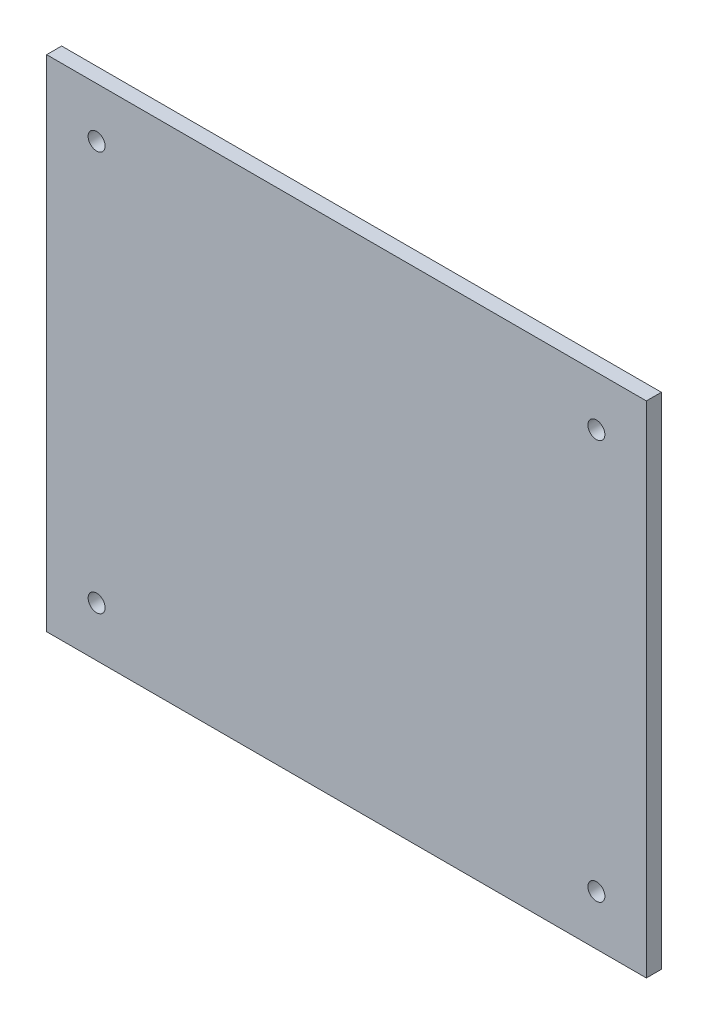
ISO-10303-21;
HEADER;
FILE_DESCRIPTION(('STEP AP214'),'2;1');
FILE_NAME('part.step','',(''),(''),'','','');
FILE_SCHEMA(('AUTOMOTIVE_DESIGN { 1 0 10303 214 1 1 1 1 }'));
ENDSEC;
DATA;
#1=APPLICATION_CONTEXT('core data for automotive mechanical design processes');
#2=APPLICATION_PROTOCOL_DEFINITION('international standard','automotive_design',2000,#1);
#3=PRODUCT_CONTEXT('',#1,'mechanical');
#4=PRODUCT('Part','Part','',(#3));
#5=PRODUCT_RELATED_PRODUCT_CATEGORY('part','',(#4));
#6=PRODUCT_DEFINITION_FORMATION('','',#4);
#7=PRODUCT_DEFINITION_CONTEXT('part definition',#1,'design');
#8=PRODUCT_DEFINITION('design','',#6,#7);
#9=PRODUCT_DEFINITION_SHAPE('','',#8);
#10=(LENGTH_UNIT() NAMED_UNIT(*) SI_UNIT(.MILLI.,.METRE.));
#11=(NAMED_UNIT(*) PLANE_ANGLE_UNIT() SI_UNIT($,.RADIAN.));
#12=(NAMED_UNIT(*) SI_UNIT($,.STERADIAN.) SOLID_ANGLE_UNIT());
#13=UNCERTAINTY_MEASURE_WITH_UNIT(LENGTH_MEASURE(1.E-05),#10,'distance_accuracy_value','');
#14=(GEOMETRIC_REPRESENTATION_CONTEXT(3) GLOBAL_UNCERTAINTY_ASSIGNED_CONTEXT((#13)) GLOBAL_UNIT_ASSIGNED_CONTEXT((#10,
#11,#12)) REPRESENTATION_CONTEXT('',''));
#15=CARTESIAN_POINT('',(0.,0.,0.));
#16=DIRECTION('',(0.,0.,1.));
#17=DIRECTION('',(1.,0.,0.));
#18=AXIS2_PLACEMENT_3D('',#15,#16,#17);
#19=CARTESIAN_POINT('',(0.,0.,3.));
#20=DIRECTION('',(0.,0.,1.));
#21=DIRECTION('',(1.,0.,0.));
#22=AXIS2_PLACEMENT_3D('',#19,#20,#21);
#23=PLANE('',#22);
#24=CARTESIAN_POINT('',(110.,10.,3.));
#25=DIRECTION('',(0.,0.,1.));
#26=DIRECTION('',(1.,0.,0.));
#27=AXIS2_PLACEMENT_3D('',#24,#25,#26);
#28=CIRCLE('',#27,1.69999999999999);
#29=CARTESIAN_POINT('',(111.7,10.,3.));
#30=VERTEX_POINT('',#29);
#31=EDGE_CURVE('E127',#30,#30,#28,.T.);
#32=ORIENTED_EDGE('',*,*,#31,.F.);
#33=EDGE_LOOP('',(#32));
#34=FACE_BOUND('',#33,.T.);
#35=CARTESIAN_POINT('',(10.,10.,3.));
#36=DIRECTION('',(0.,0.,1.));
#37=DIRECTION('',(1.,0.,0.));
#38=AXIS2_PLACEMENT_3D('',#35,#36,#37);
#39=CIRCLE('',#38,1.7);
#40=CARTESIAN_POINT('',(11.7,10.,3.));
#41=VERTEX_POINT('',#40);
#42=EDGE_CURVE('E106',#41,#41,#39,.T.);
#43=ORIENTED_EDGE('',*,*,#42,.F.);
#44=EDGE_LOOP('',(#43));
#45=FACE_BOUND('',#44,.T.);
#46=DIRECTION('',(0.,-1.,0.));
#47=VECTOR('',#46,1.);
#48=CARTESIAN_POINT('',(0.,100.,3.));
#49=LINE('',#48,#47);
#50=CARTESIAN_POINT('',(0.,100.,3.));
#51=VERTEX_POINT('',#50);
#52=CARTESIAN_POINT('',(0.,0.,3.));
#53=VERTEX_POINT('',#52);
#54=EDGE_CURVE('E91',#51,#53,#49,.T.);
#55=ORIENTED_EDGE('',*,*,#54,.T.);
#56=DIRECTION('',(1.,0.,0.));
#57=VECTOR('',#56,1.);
#58=CARTESIAN_POINT('',(0.,0.,3.));
#59=LINE('',#58,#57);
#60=CARTESIAN_POINT('',(120.,0.,3.));
#61=VERTEX_POINT('',#60);
#62=EDGE_CURVE('E86',#53,#61,#59,.T.);
#63=ORIENTED_EDGE('',*,*,#62,.T.);
#64=DIRECTION('',(0.,1.,0.));
#65=VECTOR('',#64,1.);
#66=CARTESIAN_POINT('',(120.,0.,3.));
#67=LINE('',#66,#65);
#68=CARTESIAN_POINT('',(120.,100.,3.));
#69=VERTEX_POINT('',#68);
#70=EDGE_CURVE('E89',#61,#69,#67,.T.);
#71=ORIENTED_EDGE('',*,*,#70,.T.);
#72=DIRECTION('',(-1.,0.,0.));
#73=VECTOR('',#72,1.);
#74=CARTESIAN_POINT('',(120.,100.,3.));
#75=LINE('',#74,#73);
#76=EDGE_CURVE('E56',#69,#51,#75,.T.);
#77=ORIENTED_EDGE('',*,*,#76,.T.);
#78=EDGE_LOOP('',(#55,#63,#71,#77));
#79=FACE_BOUND('',#78,.T.);
#80=CARTESIAN_POINT('',(10.,90.,3.));
#81=DIRECTION('',(0.,0.,1.));
#82=DIRECTION('',(1.,0.,0.));
#83=AXIS2_PLACEMENT_3D('',#80,#81,#82);
#84=CIRCLE('',#83,1.7);
#85=CARTESIAN_POINT('',(11.7,90.,3.));
#86=VERTEX_POINT('',#85);
#87=EDGE_CURVE('E121',#86,#86,#84,.T.);
#88=ORIENTED_EDGE('',*,*,#87,.F.);
#89=EDGE_LOOP('',(#88));
#90=FACE_BOUND('',#89,.T.);
#91=CARTESIAN_POINT('',(110.,90.,3.));
#92=DIRECTION('',(0.,0.,1.));
#93=DIRECTION('',(1.,0.,0.));
#94=AXIS2_PLACEMENT_3D('',#91,#92,#93);
#95=CIRCLE('',#94,1.69999999999999);
#96=CARTESIAN_POINT('',(111.7,90.,3.));
#97=VERTEX_POINT('',#96);
#98=EDGE_CURVE('E133',#97,#97,#95,.T.);
#99=ORIENTED_EDGE('',*,*,#98,.F.);
#100=EDGE_LOOP('',(#99));
#101=FACE_BOUND('',#100,.T.);
#102=ADVANCED_FACE('F39',(#34,#45,#79,#90,#101),#23,.T.);
#103=CARTESIAN_POINT('',(0.,0.,0.));
#104=DIRECTION('',(0.,0.,1.));
#105=DIRECTION('',(1.,0.,0.));
#106=AXIS2_PLACEMENT_3D('',#103,#104,#105);
#107=PLANE('',#106);
#108=DIRECTION('',(0.,-1.,0.));
#109=VECTOR('',#108,1.);
#110=CARTESIAN_POINT('',(0.,100.,0.));
#111=LINE('',#110,#109);
#112=CARTESIAN_POINT('',(0.,100.,0.));
#113=VERTEX_POINT('',#112);
#114=CARTESIAN_POINT('',(0.,0.,0.));
#115=VERTEX_POINT('',#114);
#116=EDGE_CURVE('E103',#113,#115,#111,.T.);
#117=ORIENTED_EDGE('',*,*,#116,.F.);
#118=DIRECTION('',(-1.,0.,0.));
#119=VECTOR('',#118,1.);
#120=CARTESIAN_POINT('',(120.,100.,0.));
#121=LINE('',#120,#119);
#122=CARTESIAN_POINT('',(120.,100.,0.));
#123=VERTEX_POINT('',#122);
#124=EDGE_CURVE('E79',#123,#113,#121,.T.);
#125=ORIENTED_EDGE('',*,*,#124,.F.);
#126=DIRECTION('',(0.,1.,0.));
#127=VECTOR('',#126,1.);
#128=CARTESIAN_POINT('',(120.,0.,0.));
#129=LINE('',#128,#127);
#130=CARTESIAN_POINT('',(120.,0.,0.));
#131=VERTEX_POINT('',#130);
#132=EDGE_CURVE('E73',#131,#123,#129,.T.);
#133=ORIENTED_EDGE('',*,*,#132,.F.);
#134=DIRECTION('',(1.,0.,0.));
#135=VECTOR('',#134,1.);
#136=CARTESIAN_POINT('',(0.,0.,0.));
#137=LINE('',#136,#135);
#138=EDGE_CURVE('E95',#115,#131,#137,.T.);
#139=ORIENTED_EDGE('',*,*,#138,.F.);
#140=EDGE_LOOP('',(#117,#125,#133,#139));
#141=FACE_BOUND('',#140,.T.);
#142=CARTESIAN_POINT('',(10.,10.,0.));
#143=DIRECTION('',(0.,0.,1.));
#144=DIRECTION('',(1.,0.,0.));
#145=AXIS2_PLACEMENT_3D('',#142,#143,#144);
#146=CIRCLE('',#145,1.7);
#147=CARTESIAN_POINT('',(11.7,10.,0.));
#148=VERTEX_POINT('',#147);
#149=EDGE_CURVE('E118',#148,#148,#146,.T.);
#150=ORIENTED_EDGE('',*,*,#149,.T.);
#151=EDGE_LOOP('',(#150));
#152=FACE_BOUND('',#151,.T.);
#153=CARTESIAN_POINT('',(10.,90.,0.));
#154=DIRECTION('',(0.,0.,1.));
#155=DIRECTION('',(1.,0.,0.));
#156=AXIS2_PLACEMENT_3D('',#153,#154,#155);
#157=CIRCLE('',#156,1.7);
#158=CARTESIAN_POINT('',(11.7,90.,0.));
#159=VERTEX_POINT('',#158);
#160=EDGE_CURVE('E124',#159,#159,#157,.T.);
#161=ORIENTED_EDGE('',*,*,#160,.T.);
#162=EDGE_LOOP('',(#161));
#163=FACE_BOUND('',#162,.T.);
#164=CARTESIAN_POINT('',(110.,10.,0.));
#165=DIRECTION('',(0.,0.,1.));
#166=DIRECTION('',(1.,0.,0.));
#167=AXIS2_PLACEMENT_3D('',#164,#165,#166);
#168=CIRCLE('',#167,1.69999999999999);
#169=CARTESIAN_POINT('',(111.7,10.,0.));
#170=VERTEX_POINT('',#169);
#171=EDGE_CURVE('E130',#170,#170,#168,.T.);
#172=ORIENTED_EDGE('',*,*,#171,.T.);
#173=EDGE_LOOP('',(#172));
#174=FACE_BOUND('',#173,.T.);
#175=CARTESIAN_POINT('',(110.,90.,0.));
#176=DIRECTION('',(0.,0.,1.));
#177=DIRECTION('',(1.,0.,0.));
#178=AXIS2_PLACEMENT_3D('',#175,#176,#177);
#179=CIRCLE('',#178,1.69999999999999);
#180=CARTESIAN_POINT('',(111.7,90.,0.));
#181=VERTEX_POINT('',#180);
#182=EDGE_CURVE('E136',#181,#181,#179,.T.);
#183=ORIENTED_EDGE('',*,*,#182,.T.);
#184=EDGE_LOOP('',(#183));
#185=FACE_BOUND('',#184,.T.);
#186=ADVANCED_FACE('F114',(#141,#152,#163,#174,#185),#107,.F.);
#187=CARTESIAN_POINT('',(0.,100.,3.));
#188=DIRECTION('',(1.,0.,0.));
#189=DIRECTION('',(0.,0.,-1.));
#190=AXIS2_PLACEMENT_3D('',#187,#188,#189);
#191=PLANE('',#190);
#192=ORIENTED_EDGE('',*,*,#116,.T.);
#193=DIRECTION('',(0.,0.,-1.));
#194=VECTOR('',#193,1.);
#195=CARTESIAN_POINT('',(0.,0.,3.));
#196=LINE('',#195,#194);
#197=EDGE_CURVE('E11',#53,#115,#196,.T.);
#198=ORIENTED_EDGE('',*,*,#197,.F.);
#199=ORIENTED_EDGE('',*,*,#54,.F.);
#200=DIRECTION('',(0.,0.,-1.));
#201=VECTOR('',#200,1.);
#202=CARTESIAN_POINT('',(0.,100.,3.));
#203=LINE('',#202,#201);
#204=EDGE_CURVE('E99',#51,#113,#203,.T.);
#205=ORIENTED_EDGE('',*,*,#204,.T.);
#206=EDGE_LOOP('',(#192,#198,#199,#205));
#207=FACE_BOUND('',#206,.T.);
#208=ADVANCED_FACE('F41',(#207),#191,.F.);
#209=CARTESIAN_POINT('',(0.,0.,3.));
#210=DIRECTION('',(0.,1.,0.));
#211=DIRECTION('',(0.,0.,1.));
#212=AXIS2_PLACEMENT_3D('',#209,#210,#211);
#213=PLANE('',#212);
#214=ORIENTED_EDGE('',*,*,#138,.T.);
#215=DIRECTION('',(0.,0.,-1.));
#216=VECTOR('',#215,1.);
#217=CARTESIAN_POINT('',(120.,0.,3.));
#218=LINE('',#217,#216);
#219=EDGE_CURVE('E48',#61,#131,#218,.T.);
#220=ORIENTED_EDGE('',*,*,#219,.F.);
#221=ORIENTED_EDGE('',*,*,#62,.F.);
#222=ORIENTED_EDGE('',*,*,#197,.T.);
#223=EDGE_LOOP('',(#214,#220,#221,#222));
#224=FACE_BOUND('',#223,.T.);
#225=ADVANCED_FACE('F94',(#224),#213,.F.);
#226=CARTESIAN_POINT('',(120.,0.,3.));
#227=DIRECTION('',(-1.,0.,0.));
#228=DIRECTION('',(0.,0.,1.));
#229=AXIS2_PLACEMENT_3D('',#226,#227,#228);
#230=PLANE('',#229);
#231=ORIENTED_EDGE('',*,*,#132,.T.);
#232=DIRECTION('',(0.,0.,-1.));
#233=VECTOR('',#232,1.);
#234=CARTESIAN_POINT('',(120.,100.,3.));
#235=LINE('',#234,#233);
#236=EDGE_CURVE('E96',#69,#123,#235,.T.);
#237=ORIENTED_EDGE('',*,*,#236,.F.);
#238=ORIENTED_EDGE('',*,*,#70,.F.);
#239=ORIENTED_EDGE('',*,*,#219,.T.);
#240=EDGE_LOOP('',(#231,#237,#238,#239));
#241=FACE_BOUND('',#240,.T.);
#242=ADVANCED_FACE('F97',(#241),#230,.F.);
#243=CARTESIAN_POINT('',(120.,100.,3.));
#244=DIRECTION('',(0.,-1.,0.));
#245=DIRECTION('',(0.,0.,-1.));
#246=AXIS2_PLACEMENT_3D('',#243,#244,#245);
#247=PLANE('',#246);
#248=ORIENTED_EDGE('',*,*,#124,.T.);
#249=ORIENTED_EDGE('',*,*,#204,.F.);
#250=ORIENTED_EDGE('',*,*,#76,.F.);
#251=ORIENTED_EDGE('',*,*,#236,.T.);
#252=EDGE_LOOP('',(#248,#249,#250,#251));
#253=FACE_BOUND('',#252,.T.);
#254=ADVANCED_FACE('F111',(#253),#247,.F.);
#255=CARTESIAN_POINT('',(10.,10.,3.));
#256=DIRECTION('',(0.,0.,-1.));
#257=DIRECTION('',(-1.,0.,0.));
#258=AXIS2_PLACEMENT_3D('',#255,#256,#257);
#259=CYLINDRICAL_SURFACE('',#258,1.7);
#260=ORIENTED_EDGE('',*,*,#42,.T.);
#261=EDGE_LOOP('',(#260));
#262=FACE_BOUND('',#261,.T.);
#263=ORIENTED_EDGE('',*,*,#149,.F.);
#264=EDGE_LOOP('',(#263));
#265=FACE_BOUND('',#264,.T.);
#266=ADVANCED_FACE('F155',(#262,#265),#259,.F.);
#267=CARTESIAN_POINT('',(10.,90.,3.));
#268=DIRECTION('',(0.,0.,-1.));
#269=DIRECTION('',(-1.,0.,0.));
#270=AXIS2_PLACEMENT_3D('',#267,#268,#269);
#271=CYLINDRICAL_SURFACE('',#270,1.7);
#272=ORIENTED_EDGE('',*,*,#87,.T.);
#273=EDGE_LOOP('',(#272));
#274=FACE_BOUND('',#273,.T.);
#275=ORIENTED_EDGE('',*,*,#160,.F.);
#276=EDGE_LOOP('',(#275));
#277=FACE_BOUND('',#276,.T.);
#278=ADVANCED_FACE('F209',(#274,#277),#271,.F.);
#279=CARTESIAN_POINT('',(110.,10.,3.));
#280=DIRECTION('',(0.,0.,-1.));
#281=DIRECTION('',(-1.,0.,0.));
#282=AXIS2_PLACEMENT_3D('',#279,#280,#281);
#283=CYLINDRICAL_SURFACE('',#282,1.69999999999999);
#284=ORIENTED_EDGE('',*,*,#31,.T.);
#285=EDGE_LOOP('',(#284));
#286=FACE_BOUND('',#285,.T.);
#287=ORIENTED_EDGE('',*,*,#171,.F.);
#288=EDGE_LOOP('',(#287));
#289=FACE_BOUND('',#288,.T.);
#290=ADVANCED_FACE('F218',(#286,#289),#283,.F.);
#291=CARTESIAN_POINT('',(110.,90.,3.));
#292=DIRECTION('',(0.,0.,-1.));
#293=DIRECTION('',(-1.,0.,0.));
#294=AXIS2_PLACEMENT_3D('',#291,#292,#293);
#295=CYLINDRICAL_SURFACE('',#294,1.69999999999999);
#296=ORIENTED_EDGE('',*,*,#98,.T.);
#297=EDGE_LOOP('',(#296));
#298=FACE_BOUND('',#297,.T.);
#299=ORIENTED_EDGE('',*,*,#182,.F.);
#300=EDGE_LOOP('',(#299));
#301=FACE_BOUND('',#300,.T.);
#302=ADVANCED_FACE('F142',(#298,#301),#295,.F.);
#303=CLOSED_SHELL('',(#102,#186,#208,#225,#242,#254,#266,#278,#290,#302));
#304=MANIFOLD_SOLID_BREP('B2',#303);
#305=ADVANCED_BREP_SHAPE_REPRESENTATION('',(#18,#304),#14);
#306=SHAPE_DEFINITION_REPRESENTATION(#9,#305);
ENDSEC;
END-ISO-10303-21;
